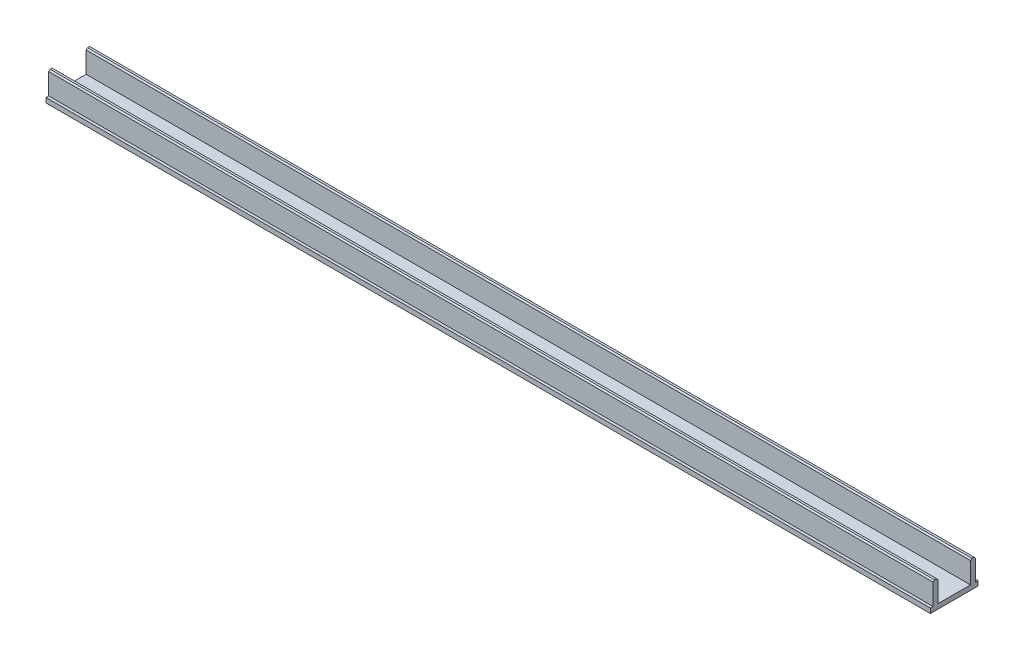
ISO-10303-21;
HEADER;
FILE_DESCRIPTION(('STEP AP214'),'2;1');
FILE_NAME('part.step','',(''),(''),'','','');
FILE_SCHEMA(('AUTOMOTIVE_DESIGN { 1 0 10303 214 1 1 1 1 }'));
ENDSEC;
DATA;
#1=APPLICATION_CONTEXT('core data for automotive mechanical design processes');
#2=APPLICATION_PROTOCOL_DEFINITION('international standard','automotive_design',2000,#1);
#3=PRODUCT_CONTEXT('',#1,'mechanical');
#4=PRODUCT('Part','Part','',(#3));
#5=PRODUCT_RELATED_PRODUCT_CATEGORY('part','',(#4));
#6=PRODUCT_DEFINITION_FORMATION('','',#4);
#7=PRODUCT_DEFINITION_CONTEXT('part definition',#1,'design');
#8=PRODUCT_DEFINITION('design','',#6,#7);
#9=PRODUCT_DEFINITION_SHAPE('','',#8);
#10=(LENGTH_UNIT() NAMED_UNIT(*) SI_UNIT(.MILLI.,.METRE.));
#11=(NAMED_UNIT(*) PLANE_ANGLE_UNIT() SI_UNIT($,.RADIAN.));
#12=(NAMED_UNIT(*) SI_UNIT($,.STERADIAN.) SOLID_ANGLE_UNIT());
#13=UNCERTAINTY_MEASURE_WITH_UNIT(LENGTH_MEASURE(1.E-05),#10,'distance_accuracy_value','');
#14=(GEOMETRIC_REPRESENTATION_CONTEXT(3) GLOBAL_UNCERTAINTY_ASSIGNED_CONTEXT((#13)) GLOBAL_UNIT_ASSIGNED_CONTEXT((#10,
#11,#12)) REPRESENTATION_CONTEXT('',''));
#15=CARTESIAN_POINT('',(0.,0.,0.));
#16=DIRECTION('',(0.,0.,1.));
#17=DIRECTION('',(1.,0.,0.));
#18=AXIS2_PLACEMENT_3D('',#15,#16,#17);
#19=CARTESIAN_POINT('',(130.,0.7,-3.5));
#20=DIRECTION('',(0.,0.,1.));
#21=DIRECTION('',(1.,0.,0.));
#22=AXIS2_PLACEMENT_3D('',#19,#20,#21);
#23=PLANE('',#22);
#24=DIRECTION('',(0.,1.,0.));
#25=VECTOR('',#24,1.);
#26=CARTESIAN_POINT('',(0.,0.7,-3.5));
#27=LINE('',#26,#25);
#28=CARTESIAN_POINT('',(0.,0.,-3.5));
#29=VERTEX_POINT('',#28);
#30=CARTESIAN_POINT('',(0.,0.7,-3.5));
#31=VERTEX_POINT('',#30);
#32=EDGE_CURVE('E174',#29,#31,#27,.T.);
#33=ORIENTED_EDGE('',*,*,#32,.T.);
#34=DIRECTION('',(-1.,0.,0.));
#35=VECTOR('',#34,1.);
#36=CARTESIAN_POINT('',(130.,0.7,-3.5));
#37=LINE('',#36,#35);
#38=CARTESIAN_POINT('',(130.,0.7,-3.5));
#39=VERTEX_POINT('',#38);
#40=EDGE_CURVE('E155',#39,#31,#37,.T.);
#41=ORIENTED_EDGE('',*,*,#40,.F.);
#42=DIRECTION('',(0.,1.,0.));
#43=VECTOR('',#42,1.);
#44=CARTESIAN_POINT('',(130.,0.7,-3.5));
#45=LINE('',#44,#43);
#46=CARTESIAN_POINT('',(130.,0.,-3.5));
#47=VERTEX_POINT('',#46);
#48=EDGE_CURVE('E162',#47,#39,#45,.T.);
#49=ORIENTED_EDGE('',*,*,#48,.F.);
#50=DIRECTION('',(-1.,0.,0.));
#51=VECTOR('',#50,1.);
#52=CARTESIAN_POINT('',(130.,0.,-3.5));
#53=LINE('',#52,#51);
#54=EDGE_CURVE('E246',#47,#29,#53,.T.);
#55=ORIENTED_EDGE('',*,*,#54,.T.);
#56=EDGE_LOOP('',(#33,#41,#49,#55));
#57=FACE_BOUND('',#56,.T.);
#58=ADVANCED_FACE('F35',(#57),#23,.F.);
#59=CARTESIAN_POINT('',(130.,0.7,-3.5));
#60=DIRECTION('',(0.,-1.,0.));
#61=DIRECTION('',(0.,0.,-1.));
#62=AXIS2_PLACEMENT_3D('',#59,#60,#61);
#63=PLANE('',#62);
#64=DIRECTION('',(0.,0.,1.));
#65=VECTOR('',#64,1.);
#66=CARTESIAN_POINT('',(0.,0.7,-3.5));
#67=LINE('',#66,#65);
#68=CARTESIAN_POINT('',(0.,0.7,-3.1));
#69=VERTEX_POINT('',#68);
#70=EDGE_CURVE('E275',#31,#69,#67,.T.);
#71=ORIENTED_EDGE('',*,*,#70,.T.);
#72=DIRECTION('',(-1.,0.,0.));
#73=VECTOR('',#72,1.);
#74=CARTESIAN_POINT('',(130.,0.7,-3.1));
#75=LINE('',#74,#73);
#76=CARTESIAN_POINT('',(130.,0.7,-3.1));
#77=VERTEX_POINT('',#76);
#78=EDGE_CURVE('E158',#77,#69,#75,.T.);
#79=ORIENTED_EDGE('',*,*,#78,.F.);
#80=DIRECTION('',(0.,0.,1.));
#81=VECTOR('',#80,1.);
#82=CARTESIAN_POINT('',(130.,0.7,-3.5));
#83=LINE('',#82,#81);
#84=EDGE_CURVE('E151',#39,#77,#83,.T.);
#85=ORIENTED_EDGE('',*,*,#84,.F.);
#86=ORIENTED_EDGE('',*,*,#40,.T.);
#87=EDGE_LOOP('',(#71,#79,#85,#86));
#88=FACE_BOUND('',#87,.T.);
#89=ADVANCED_FACE('F153',(#88),#63,.F.);
#90=CARTESIAN_POINT('',(130.,4.,-3.1));
#91=DIRECTION('',(0.,0.,1.));
#92=DIRECTION('',(0.,-1.,0.));
#93=AXIS2_PLACEMENT_3D('',#90,#91,#92);
#94=PLANE('',#93);
#95=DIRECTION('',(0.,1.,0.));
#96=VECTOR('',#95,1.);
#97=CARTESIAN_POINT('',(0.,4.,-3.1));
#98=LINE('',#97,#96);
#99=CARTESIAN_POINT('',(0.,3.79999999999995,-3.1));
#100=VERTEX_POINT('',#99);
#101=EDGE_CURVE('E272',#69,#100,#98,.T.);
#102=ORIENTED_EDGE('',*,*,#101,.T.);
#103=DIRECTION('',(1.,0.,0.));
#104=VECTOR('',#103,1.);
#105=CARTESIAN_POINT('',(130.,3.79999999999995,-3.1));
#106=LINE('',#105,#104);
#107=CARTESIAN_POINT('',(130.,3.79999999999995,-3.1));
#108=VERTEX_POINT('',#107);
#109=EDGE_CURVE('E193',#100,#108,#106,.T.);
#110=ORIENTED_EDGE('',*,*,#109,.T.);
#111=DIRECTION('',(0.,1.,0.));
#112=VECTOR('',#111,1.);
#113=CARTESIAN_POINT('',(130.,4.,-3.1));
#114=LINE('',#113,#112);
#115=EDGE_CURVE('E161',#77,#108,#114,.T.);
#116=ORIENTED_EDGE('',*,*,#115,.F.);
#117=ORIENTED_EDGE('',*,*,#78,.T.);
#118=EDGE_LOOP('',(#102,#110,#116,#117));
#119=FACE_BOUND('',#118,.T.);
#120=ADVANCED_FACE('F315',(#119),#94,.F.);
#121=CARTESIAN_POINT('',(130.,4.,-2.4));
#122=DIRECTION('',(0.,-1.,0.));
#123=DIRECTION('',(0.,0.,-1.));
#124=AXIS2_PLACEMENT_3D('',#121,#122,#123);
#125=PLANE('',#124);
#126=DIRECTION('',(0.,0.,1.));
#127=VECTOR('',#126,1.);
#128=CARTESIAN_POINT('',(130.,4.,-2.4));
#129=LINE('',#128,#127);
#130=CARTESIAN_POINT('',(130.,4.,-2.89999999999997));
#131=VERTEX_POINT('',#130);
#132=CARTESIAN_POINT('',(130.,4.,-2.60000000000002));
#133=VERTEX_POINT('',#132);
#134=EDGE_CURVE('E289',#131,#133,#129,.T.);
#135=ORIENTED_EDGE('',*,*,#134,.F.);
#136=DIRECTION('',(-1.,0.,0.));
#137=VECTOR('',#136,1.);
#138=CARTESIAN_POINT('',(130.,4.,-2.89999999999997));
#139=LINE('',#138,#137);
#140=CARTESIAN_POINT('',(0.,4.,-2.89999999999997));
#141=VERTEX_POINT('',#140);
#142=EDGE_CURVE('E177',#131,#141,#139,.T.);
#143=ORIENTED_EDGE('',*,*,#142,.T.);
#144=DIRECTION('',(0.,0.,1.));
#145=VECTOR('',#144,1.);
#146=CARTESIAN_POINT('',(0.,4.,-2.4));
#147=LINE('',#146,#145);
#148=CARTESIAN_POINT('',(0.,4.,-2.60000000000002));
#149=VERTEX_POINT('',#148);
#150=EDGE_CURVE('E267',#141,#149,#147,.T.);
#151=ORIENTED_EDGE('',*,*,#150,.T.);
#152=DIRECTION('',(1.,0.,0.));
#153=VECTOR('',#152,1.);
#154=CARTESIAN_POINT('',(130.,4.,-2.60000000000002));
#155=LINE('',#154,#153);
#156=EDGE_CURVE('E175',#149,#133,#155,.T.);
#157=ORIENTED_EDGE('',*,*,#156,.T.);
#158=EDGE_LOOP('',(#135,#143,#151,#157));
#159=FACE_BOUND('',#158,.T.);
#160=ADVANCED_FACE('F300',(#159),#125,.F.);
#161=CARTESIAN_POINT('',(130.,4.,-2.4));
#162=DIRECTION('',(0.,0.,-1.));
#163=DIRECTION('',(0.,1.,0.));
#164=AXIS2_PLACEMENT_3D('',#161,#162,#163);
#165=PLANE('',#164);
#166=DIRECTION('',(0.,-1.,0.));
#167=VECTOR('',#166,1.);
#168=CARTESIAN_POINT('',(130.,4.,-2.4));
#169=LINE('',#168,#167);
#170=CARTESIAN_POINT('',(130.,3.79999999999998,-2.4));
#171=VERTEX_POINT('',#170);
#172=CARTESIAN_POINT('',(130.,0.7,-2.4));
#173=VERTEX_POINT('',#172);
#174=EDGE_CURVE('E287',#171,#173,#169,.T.);
#175=ORIENTED_EDGE('',*,*,#174,.F.);
#176=DIRECTION('',(-1.,0.,0.));
#177=VECTOR('',#176,1.);
#178=CARTESIAN_POINT('',(130.,3.79999999999998,-2.4));
#179=LINE('',#178,#177);
#180=CARTESIAN_POINT('',(0.,3.79999999999998,-2.4));
#181=VERTEX_POINT('',#180);
#182=EDGE_CURVE('E202',#171,#181,#179,.T.);
#183=ORIENTED_EDGE('',*,*,#182,.T.);
#184=DIRECTION('',(0.,-1.,0.));
#185=VECTOR('',#184,1.);
#186=CARTESIAN_POINT('',(0.,4.,-2.4));
#187=LINE('',#186,#185);
#188=CARTESIAN_POINT('',(0.,0.7,-2.4));
#189=VERTEX_POINT('',#188);
#190=EDGE_CURVE('E266',#181,#189,#187,.T.);
#191=ORIENTED_EDGE('',*,*,#190,.T.);
#192=DIRECTION('',(-1.,0.,0.));
#193=VECTOR('',#192,1.);
#194=CARTESIAN_POINT('',(130.,0.7,-2.4));
#195=LINE('',#194,#193);
#196=EDGE_CURVE('E179',#173,#189,#195,.T.);
#197=ORIENTED_EDGE('',*,*,#196,.F.);
#198=EDGE_LOOP('',(#175,#183,#191,#197));
#199=FACE_BOUND('',#198,.T.);
#200=ADVANCED_FACE('F307',(#199),#165,.F.);
#201=CARTESIAN_POINT('',(130.,0.7,2.4));
#202=DIRECTION('',(0.,-1.,0.));
#203=DIRECTION('',(0.,0.,-1.));
#204=AXIS2_PLACEMENT_3D('',#201,#202,#203);
#205=PLANE('',#204);
#206=DIRECTION('',(0.,0.,1.));
#207=VECTOR('',#206,1.);
#208=CARTESIAN_POINT('',(0.,0.7,2.4));
#209=LINE('',#208,#207);
#210=CARTESIAN_POINT('',(0.,0.7,2.4));
#211=VERTEX_POINT('',#210);
#212=EDGE_CURVE('E238',#189,#211,#209,.T.);
#213=ORIENTED_EDGE('',*,*,#212,.T.);
#214=DIRECTION('',(-1.,0.,0.));
#215=VECTOR('',#214,1.);
#216=CARTESIAN_POINT('',(130.,0.7,2.4));
#217=LINE('',#216,#215);
#218=CARTESIAN_POINT('',(130.,0.7,2.4));
#219=VERTEX_POINT('',#218);
#220=EDGE_CURVE('E257',#219,#211,#217,.T.);
#221=ORIENTED_EDGE('',*,*,#220,.F.);
#222=DIRECTION('',(0.,0.,1.));
#223=VECTOR('',#222,1.);
#224=CARTESIAN_POINT('',(130.,0.7,2.4));
#225=LINE('',#224,#223);
#226=EDGE_CURVE('E221',#173,#219,#225,.T.);
#227=ORIENTED_EDGE('',*,*,#226,.F.);
#228=ORIENTED_EDGE('',*,*,#196,.T.);
#229=EDGE_LOOP('',(#213,#221,#227,#228));
#230=FACE_BOUND('',#229,.T.);
#231=ADVANCED_FACE('F262',(#230),#205,.F.);
#232=CARTESIAN_POINT('',(130.,4.,2.4));
#233=DIRECTION('',(0.,0.,1.));
#234=DIRECTION('',(0.,-1.,0.));
#235=AXIS2_PLACEMENT_3D('',#232,#233,#234);
#236=PLANE('',#235);
#237=DIRECTION('',(0.,1.,0.));
#238=VECTOR('',#237,1.);
#239=CARTESIAN_POINT('',(0.,4.,2.4));
#240=LINE('',#239,#238);
#241=CARTESIAN_POINT('',(0.,3.79999999999998,2.4));
#242=VERTEX_POINT('',#241);
#243=EDGE_CURVE('E217',#211,#242,#240,.T.);
#244=ORIENTED_EDGE('',*,*,#243,.T.);
#245=DIRECTION('',(1.,0.,0.));
#246=VECTOR('',#245,1.);
#247=CARTESIAN_POINT('',(130.,3.79999999999998,2.4));
#248=LINE('',#247,#246);
#249=CARTESIAN_POINT('',(130.,3.79999999999998,2.4));
#250=VERTEX_POINT('',#249);
#251=EDGE_CURVE('E44',#242,#250,#248,.T.);
#252=ORIENTED_EDGE('',*,*,#251,.T.);
#253=DIRECTION('',(0.,1.,0.));
#254=VECTOR('',#253,1.);
#255=CARTESIAN_POINT('',(130.,4.,2.4));
#256=LINE('',#255,#254);
#257=EDGE_CURVE('E215',#219,#250,#256,.T.);
#258=ORIENTED_EDGE('',*,*,#257,.F.);
#259=ORIENTED_EDGE('',*,*,#220,.T.);
#260=EDGE_LOOP('',(#244,#252,#258,#259));
#261=FACE_BOUND('',#260,.T.);
#262=ADVANCED_FACE('F213',(#261),#236,.F.);
#263=CARTESIAN_POINT('',(130.,4.,3.1));
#264=DIRECTION('',(0.,-1.,0.));
#265=DIRECTION('',(0.,0.,-1.));
#266=AXIS2_PLACEMENT_3D('',#263,#264,#265);
#267=PLANE('',#266);
#268=DIRECTION('',(0.,0.,1.));
#269=VECTOR('',#268,1.);
#270=CARTESIAN_POINT('',(130.,4.,3.1));
#271=LINE('',#270,#269);
#272=CARTESIAN_POINT('',(130.,4.,2.60000000000002));
#273=VERTEX_POINT('',#272);
#274=CARTESIAN_POINT('',(130.,4.,2.89999999999998));
#275=VERTEX_POINT('',#274);
#276=EDGE_CURVE('E223',#273,#275,#271,.T.);
#277=ORIENTED_EDGE('',*,*,#276,.F.);
#278=DIRECTION('',(-1.,0.,0.));
#279=VECTOR('',#278,1.);
#280=CARTESIAN_POINT('',(130.,4.,2.60000000000002));
#281=LINE('',#280,#279);
#282=CARTESIAN_POINT('',(0.,4.,2.60000000000002));
#283=VERTEX_POINT('',#282);
#284=EDGE_CURVE('E206',#273,#283,#281,.T.);
#285=ORIENTED_EDGE('',*,*,#284,.T.);
#286=DIRECTION('',(0.,0.,1.));
#287=VECTOR('',#286,1.);
#288=CARTESIAN_POINT('',(0.,4.,3.1));
#289=LINE('',#288,#287);
#290=CARTESIAN_POINT('',(0.,4.,2.89999999999998));
#291=VERTEX_POINT('',#290);
#292=EDGE_CURVE('E229',#283,#291,#289,.T.);
#293=ORIENTED_EDGE('',*,*,#292,.T.);
#294=DIRECTION('',(1.,0.,0.));
#295=VECTOR('',#294,1.);
#296=CARTESIAN_POINT('',(130.,4.,2.89999999999998));
#297=LINE('',#296,#295);
#298=EDGE_CURVE('E59',#291,#275,#297,.T.);
#299=ORIENTED_EDGE('',*,*,#298,.T.);
#300=EDGE_LOOP('',(#277,#285,#293,#299));
#301=FACE_BOUND('',#300,.T.);
#302=ADVANCED_FACE('F228',(#301),#267,.F.);
#303=CARTESIAN_POINT('',(130.,4.,3.1));
#304=DIRECTION('',(0.,0.,-1.));
#305=DIRECTION('',(0.,1.,0.));
#306=AXIS2_PLACEMENT_3D('',#303,#304,#305);
#307=PLANE('',#306);
#308=DIRECTION('',(0.,-1.,0.));
#309=VECTOR('',#308,1.);
#310=CARTESIAN_POINT('',(130.,4.,3.1));
#311=LINE('',#310,#309);
#312=CARTESIAN_POINT('',(130.,3.79999999999998,3.1));
#313=VERTEX_POINT('',#312);
#314=CARTESIAN_POINT('',(130.,0.7,3.1));
#315=VERTEX_POINT('',#314);
#316=EDGE_CURVE('E283',#313,#315,#311,.T.);
#317=ORIENTED_EDGE('',*,*,#316,.F.);
#318=DIRECTION('',(-1.,0.,0.));
#319=VECTOR('',#318,1.);
#320=CARTESIAN_POINT('',(130.,3.79999999999998,3.1));
#321=LINE('',#320,#319);
#322=CARTESIAN_POINT('',(0.,3.79999999999998,3.1));
#323=VERTEX_POINT('',#322);
#324=EDGE_CURVE('E11',#313,#323,#321,.T.);
#325=ORIENTED_EDGE('',*,*,#324,.T.);
#326=DIRECTION('',(0.,-1.,0.));
#327=VECTOR('',#326,1.);
#328=CARTESIAN_POINT('',(0.,4.,3.1));
#329=LINE('',#328,#327);
#330=CARTESIAN_POINT('',(0.,0.7,3.1));
#331=VERTEX_POINT('',#330);
#332=EDGE_CURVE('E234',#323,#331,#329,.T.);
#333=ORIENTED_EDGE('',*,*,#332,.T.);
#334=DIRECTION('',(-1.,0.,0.));
#335=VECTOR('',#334,1.);
#336=CARTESIAN_POINT('',(130.,0.7,3.1));
#337=LINE('',#336,#335);
#338=EDGE_CURVE('E254',#315,#331,#337,.T.);
#339=ORIENTED_EDGE('',*,*,#338,.F.);
#340=EDGE_LOOP('',(#317,#325,#333,#339));
#341=FACE_BOUND('',#340,.T.);
#342=ADVANCED_FACE('F346',(#341),#307,.F.);
#343=CARTESIAN_POINT('',(130.,0.7,3.5));
#344=DIRECTION('',(0.,-1.,0.));
#345=DIRECTION('',(0.,0.,-1.));
#346=AXIS2_PLACEMENT_3D('',#343,#344,#345);
#347=PLANE('',#346);
#348=DIRECTION('',(0.,0.,1.));
#349=VECTOR('',#348,1.);
#350=CARTESIAN_POINT('',(0.,0.7,3.5));
#351=LINE('',#350,#349);
#352=CARTESIAN_POINT('',(0.,0.7,3.5));
#353=VERTEX_POINT('',#352);
#354=EDGE_CURVE('E236',#331,#353,#351,.T.);
#355=ORIENTED_EDGE('',*,*,#354,.T.);
#356=DIRECTION('',(-1.,0.,0.));
#357=VECTOR('',#356,1.);
#358=CARTESIAN_POINT('',(130.,0.7,3.5));
#359=LINE('',#358,#357);
#360=CARTESIAN_POINT('',(130.,0.7,3.5));
#361=VERTEX_POINT('',#360);
#362=EDGE_CURVE('E251',#361,#353,#359,.T.);
#363=ORIENTED_EDGE('',*,*,#362,.F.);
#364=DIRECTION('',(0.,0.,1.));
#365=VECTOR('',#364,1.);
#366=CARTESIAN_POINT('',(130.,0.7,3.5));
#367=LINE('',#366,#365);
#368=EDGE_CURVE('E281',#315,#361,#367,.T.);
#369=ORIENTED_EDGE('',*,*,#368,.F.);
#370=ORIENTED_EDGE('',*,*,#338,.T.);
#371=EDGE_LOOP('',(#355,#363,#369,#370));
#372=FACE_BOUND('',#371,.T.);
#373=ADVANCED_FACE('F353',(#372),#347,.F.);
#374=CARTESIAN_POINT('',(130.,0.7,3.5));
#375=DIRECTION('',(0.,0.,-1.));
#376=DIRECTION('',(-1.,0.,0.));
#377=AXIS2_PLACEMENT_3D('',#374,#375,#376);
#378=PLANE('',#377);
#379=DIRECTION('',(0.,-1.,0.));
#380=VECTOR('',#379,1.);
#381=CARTESIAN_POINT('',(0.,0.7,3.5));
#382=LINE('',#381,#380);
#383=CARTESIAN_POINT('',(0.,0.,3.5));
#384=VERTEX_POINT('',#383);
#385=EDGE_CURVE('E243',#353,#384,#382,.T.);
#386=ORIENTED_EDGE('',*,*,#385,.T.);
#387=DIRECTION('',(-1.,0.,0.));
#388=VECTOR('',#387,1.);
#389=CARTESIAN_POINT('',(130.,0.,3.5));
#390=LINE('',#389,#388);
#391=CARTESIAN_POINT('',(130.,0.,3.5));
#392=VERTEX_POINT('',#391);
#393=EDGE_CURVE('E248',#392,#384,#390,.T.);
#394=ORIENTED_EDGE('',*,*,#393,.F.);
#395=DIRECTION('',(0.,-1.,0.));
#396=VECTOR('',#395,1.);
#397=CARTESIAN_POINT('',(130.,0.7,3.5));
#398=LINE('',#397,#396);
#399=EDGE_CURVE('E279',#361,#392,#398,.T.);
#400=ORIENTED_EDGE('',*,*,#399,.F.);
#401=ORIENTED_EDGE('',*,*,#362,.T.);
#402=EDGE_LOOP('',(#386,#394,#400,#401));
#403=FACE_BOUND('',#402,.T.);
#404=ADVANCED_FACE('F357',(#403),#378,.F.);
#405=CARTESIAN_POINT('',(130.,0.,3.5));
#406=DIRECTION('',(0.,1.,0.));
#407=DIRECTION('',(0.,0.,1.));
#408=AXIS2_PLACEMENT_3D('',#405,#406,#407);
#409=PLANE('',#408);
#410=DIRECTION('',(0.,0.,-1.));
#411=VECTOR('',#410,1.);
#412=CARTESIAN_POINT('',(0.,0.,3.5));
#413=LINE('',#412,#411);
#414=EDGE_CURVE('E171',#384,#29,#413,.T.);
#415=ORIENTED_EDGE('',*,*,#414,.T.);
#416=ORIENTED_EDGE('',*,*,#54,.F.);
#417=DIRECTION('',(0.,0.,-1.));
#418=VECTOR('',#417,1.);
#419=CARTESIAN_POINT('',(130.,0.,3.5));
#420=LINE('',#419,#418);
#421=EDGE_CURVE('E167',#392,#47,#420,.T.);
#422=ORIENTED_EDGE('',*,*,#421,.F.);
#423=ORIENTED_EDGE('',*,*,#393,.T.);
#424=EDGE_LOOP('',(#415,#416,#422,#423));
#425=FACE_BOUND('',#424,.T.);
#426=ADVANCED_FACE('F360',(#425),#409,.F.);
#427=CARTESIAN_POINT('',(130.,0.,0.));
#428=DIRECTION('',(1.,0.,0.));
#429=DIRECTION('',(0.,0.,-1.));
#430=AXIS2_PLACEMENT_3D('',#427,#428,#429);
#431=PLANE('',#430);
#432=ORIENTED_EDGE('',*,*,#115,.T.);
#433=DIRECTION('',(0.,-0.707106781186572,-0.707106781186523));
#434=VECTOR('',#433,1.);
#435=CARTESIAN_POINT('',(130.,3.44999999999984,-3.45000000000008));
#436=LINE('',#435,#434);
#437=EDGE_CURVE('E200',#108,#131,#436,.F.);
#438=ORIENTED_EDGE('',*,*,#437,.T.);
#439=ORIENTED_EDGE('',*,*,#134,.T.);
#440=DIRECTION('',(0.,0.707106781186548,-0.707106781186548));
#441=VECTOR('',#440,1.);
#442=CARTESIAN_POINT('',(130.,0.69999999999999,0.69999999999999));
#443=LINE('',#442,#441);
#444=EDGE_CURVE('E198',#133,#171,#443,.F.);
#445=ORIENTED_EDGE('',*,*,#444,.T.);
#446=ORIENTED_EDGE('',*,*,#174,.T.);
#447=ORIENTED_EDGE('',*,*,#226,.T.);
#448=ORIENTED_EDGE('',*,*,#257,.T.);
#449=DIRECTION('',(0.,-0.707106781186548,-0.707106781186548));
#450=VECTOR('',#449,1.);
#451=CARTESIAN_POINT('',(130.,0.69999999999999,-0.69999999999999));
#452=LINE('',#451,#450);
#453=EDGE_CURVE('E196',#250,#273,#452,.F.);
#454=ORIENTED_EDGE('',*,*,#453,.T.);
#455=ORIENTED_EDGE('',*,*,#276,.T.);
#456=DIRECTION('',(0.,0.707106781186548,-0.707106781186548));
#457=VECTOR('',#456,1.);
#458=CARTESIAN_POINT('',(130.,3.44999999999999,3.44999999999999));
#459=LINE('',#458,#457);
#460=EDGE_CURVE('E51',#275,#313,#459,.F.);
#461=ORIENTED_EDGE('',*,*,#460,.T.);
#462=ORIENTED_EDGE('',*,*,#316,.T.);
#463=ORIENTED_EDGE('',*,*,#368,.T.);
#464=ORIENTED_EDGE('',*,*,#399,.T.);
#465=ORIENTED_EDGE('',*,*,#421,.T.);
#466=ORIENTED_EDGE('',*,*,#48,.T.);
#467=ORIENTED_EDGE('',*,*,#84,.T.);
#468=EDGE_LOOP('',(#432,#438,#439,#445,#446,#447,#448,#454,#455,#461,#462,#463,#464,#465,#466,#467));
#469=FACE_BOUND('',#468,.T.);
#470=ADVANCED_FACE('F165',(#469),#431,.T.);
#471=CARTESIAN_POINT('',(0.,0.,0.));
#472=DIRECTION('',(1.,0.,0.));
#473=DIRECTION('',(0.,0.,-1.));
#474=AXIS2_PLACEMENT_3D('',#471,#472,#473);
#475=PLANE('',#474);
#476=ORIENTED_EDGE('',*,*,#150,.F.);
#477=DIRECTION('',(0.,0.707106781186572,0.707106781186523));
#478=VECTOR('',#477,1.);
#479=CARTESIAN_POINT('',(0.,4.,-2.89999999999997));
#480=LINE('',#479,#478);
#481=EDGE_CURVE('E191',#141,#100,#480,.F.);
#482=ORIENTED_EDGE('',*,*,#481,.T.);
#483=ORIENTED_EDGE('',*,*,#101,.F.);
#484=ORIENTED_EDGE('',*,*,#70,.F.);
#485=ORIENTED_EDGE('',*,*,#32,.F.);
#486=ORIENTED_EDGE('',*,*,#414,.F.);
#487=ORIENTED_EDGE('',*,*,#385,.F.);
#488=ORIENTED_EDGE('',*,*,#354,.F.);
#489=ORIENTED_EDGE('',*,*,#332,.F.);
#490=DIRECTION('',(0.,-0.707106781186548,0.707106781186548));
#491=VECTOR('',#490,1.);
#492=CARTESIAN_POINT('',(0.,3.79999999999998,3.1));
#493=LINE('',#492,#491);
#494=EDGE_CURVE('E185',#323,#291,#493,.F.);
#495=ORIENTED_EDGE('',*,*,#494,.T.);
#496=ORIENTED_EDGE('',*,*,#292,.F.);
#497=DIRECTION('',(0.,0.707106781186548,0.707106781186548));
#498=VECTOR('',#497,1.);
#499=CARTESIAN_POINT('',(0.,4.,2.60000000000002));
#500=LINE('',#499,#498);
#501=EDGE_CURVE('E187',#283,#242,#500,.F.);
#502=ORIENTED_EDGE('',*,*,#501,.T.);
#503=ORIENTED_EDGE('',*,*,#243,.F.);
#504=ORIENTED_EDGE('',*,*,#212,.F.);
#505=ORIENTED_EDGE('',*,*,#190,.F.);
#506=DIRECTION('',(0.,-0.707106781186548,0.707106781186548));
#507=VECTOR('',#506,1.);
#508=CARTESIAN_POINT('',(0.,3.79999999999998,-2.4));
#509=LINE('',#508,#507);
#510=EDGE_CURVE('E189',#181,#149,#509,.F.);
#511=ORIENTED_EDGE('',*,*,#510,.T.);
#512=EDGE_LOOP('',(#476,#482,#483,#484,#485,#486,#487,#488,#489,#495,#496,#502,#503,#504,#505,#511));
#513=FACE_BOUND('',#512,.T.);
#514=ADVANCED_FACE('F232',(#513),#475,.F.);
#515=CARTESIAN_POINT('',(130.,4.,-2.89999999999997));
#516=DIRECTION('',(0.,-0.707106781186523,0.707106781186572));
#517=DIRECTION('',(-1.,0.,0.));
#518=AXIS2_PLACEMENT_3D('',#515,#516,#517);
#519=PLANE('',#518);
#520=ORIENTED_EDGE('',*,*,#437,.F.);
#521=ORIENTED_EDGE('',*,*,#109,.F.);
#522=ORIENTED_EDGE('',*,*,#481,.F.);
#523=ORIENTED_EDGE('',*,*,#142,.F.);
#524=EDGE_LOOP('',(#520,#521,#522,#523));
#525=FACE_BOUND('',#524,.T.);
#526=ADVANCED_FACE('F298',(#525),#519,.F.);
#527=CARTESIAN_POINT('',(130.,3.79999999999998,-2.4));
#528=DIRECTION('',(0.,-0.707106781186548,-0.707106781186548));
#529=DIRECTION('',(-1.,0.,0.));
#530=AXIS2_PLACEMENT_3D('',#527,#528,#529);
#531=PLANE('',#530);
#532=ORIENTED_EDGE('',*,*,#444,.F.);
#533=ORIENTED_EDGE('',*,*,#156,.F.);
#534=ORIENTED_EDGE('',*,*,#510,.F.);
#535=ORIENTED_EDGE('',*,*,#182,.F.);
#536=EDGE_LOOP('',(#532,#533,#534,#535));
#537=FACE_BOUND('',#536,.T.);
#538=ADVANCED_FACE('F306',(#537),#531,.F.);
#539=CARTESIAN_POINT('',(130.,4.,2.60000000000002));
#540=DIRECTION('',(0.,-0.707106781186548,0.707106781186548));
#541=DIRECTION('',(-1.,0.,0.));
#542=AXIS2_PLACEMENT_3D('',#539,#540,#541);
#543=PLANE('',#542);
#544=ORIENTED_EDGE('',*,*,#453,.F.);
#545=ORIENTED_EDGE('',*,*,#251,.F.);
#546=ORIENTED_EDGE('',*,*,#501,.F.);
#547=ORIENTED_EDGE('',*,*,#284,.F.);
#548=EDGE_LOOP('',(#544,#545,#546,#547));
#549=FACE_BOUND('',#548,.T.);
#550=ADVANCED_FACE('F226',(#549),#543,.F.);
#551=CARTESIAN_POINT('',(130.,3.79999999999998,3.1));
#552=DIRECTION('',(0.,-0.707106781186548,-0.707106781186548));
#553=DIRECTION('',(-1.,0.,0.));
#554=AXIS2_PLACEMENT_3D('',#551,#552,#553);
#555=PLANE('',#554);
#556=ORIENTED_EDGE('',*,*,#460,.F.);
#557=ORIENTED_EDGE('',*,*,#298,.F.);
#558=ORIENTED_EDGE('',*,*,#494,.F.);
#559=ORIENTED_EDGE('',*,*,#324,.F.);
#560=EDGE_LOOP('',(#556,#557,#558,#559));
#561=FACE_BOUND('',#560,.T.);
#562=ADVANCED_FACE('F38',(#561),#555,.F.);
#563=CLOSED_SHELL('',(#58,#89,#120,#160,#200,#231,#262,#302,#342,#373,#404,#426,#470,#514,#526,
#538,#550,#562));
#564=MANIFOLD_SOLID_BREP('B2',#563);
#565=ADVANCED_BREP_SHAPE_REPRESENTATION('',(#18,#564),#14);
#566=SHAPE_DEFINITION_REPRESENTATION(#9,#565);
ENDSEC;
END-ISO-10303-21;
